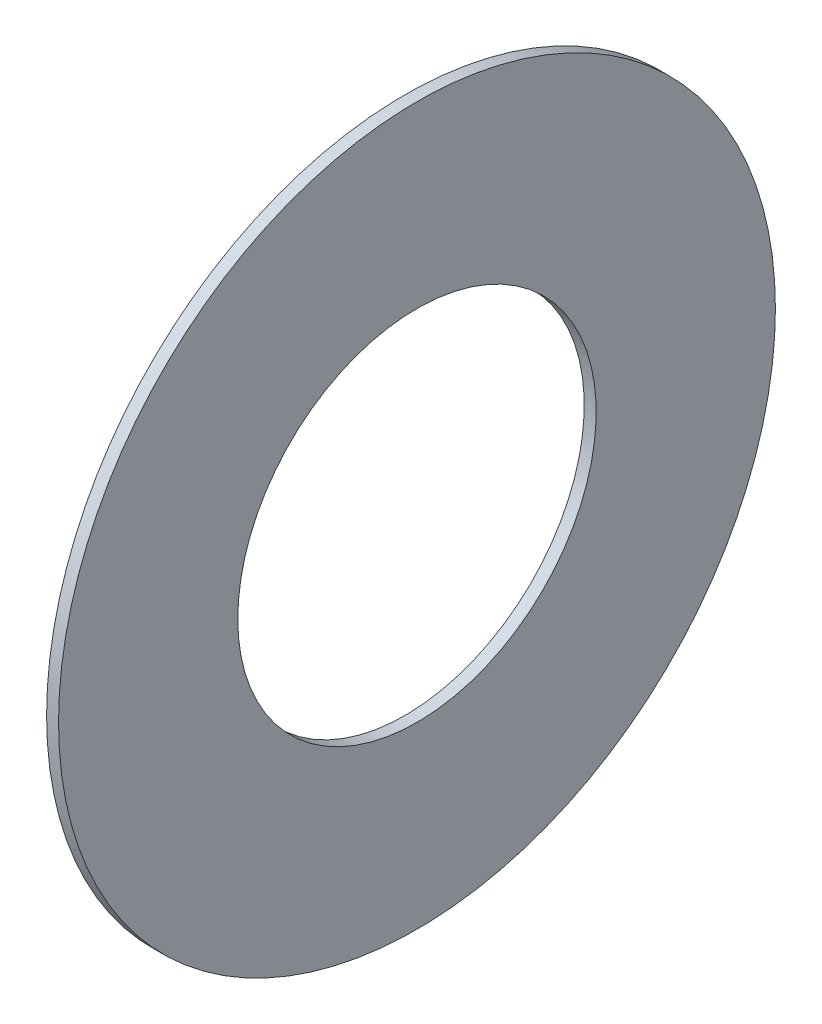
ISO-10303-21;
HEADER;
FILE_DESCRIPTION(('STEP AP214'),'2;1');
FILE_NAME('part.step','',(''),(''),'','','');
FILE_SCHEMA(('AUTOMOTIVE_DESIGN { 1 0 10303 214 1 1 1 1 }'));
ENDSEC;
DATA;
#1=APPLICATION_CONTEXT('core data for automotive mechanical design processes');
#2=APPLICATION_PROTOCOL_DEFINITION('international standard','automotive_design',2000,#1);
#3=PRODUCT_CONTEXT('',#1,'mechanical');
#4=PRODUCT('Part','Part','',(#3));
#5=PRODUCT_RELATED_PRODUCT_CATEGORY('part','',(#4));
#6=PRODUCT_DEFINITION_FORMATION('','',#4);
#7=PRODUCT_DEFINITION_CONTEXT('part definition',#1,'design');
#8=PRODUCT_DEFINITION('design','',#6,#7);
#9=PRODUCT_DEFINITION_SHAPE('','',#8);
#10=(LENGTH_UNIT() NAMED_UNIT(*) SI_UNIT(.MILLI.,.METRE.));
#11=(NAMED_UNIT(*) PLANE_ANGLE_UNIT() SI_UNIT($,.RADIAN.));
#12=(NAMED_UNIT(*) SI_UNIT($,.STERADIAN.) SOLID_ANGLE_UNIT());
#13=UNCERTAINTY_MEASURE_WITH_UNIT(LENGTH_MEASURE(1.E-05),#10,'distance_accuracy_value','');
#14=(GEOMETRIC_REPRESENTATION_CONTEXT(3) GLOBAL_UNCERTAINTY_ASSIGNED_CONTEXT((#13)) GLOBAL_UNIT_ASSIGNED_CONTEXT((#10,
#11,#12)) REPRESENTATION_CONTEXT('',''));
#15=CARTESIAN_POINT('',(0.,0.,0.));
#16=DIRECTION('',(0.,0.,1.));
#17=DIRECTION('',(1.,0.,0.));
#18=AXIS2_PLACEMENT_3D('',#15,#16,#17);
#19=CARTESIAN_POINT('',(1.,0.,0.));
#20=DIRECTION('',(-1.,0.,0.));
#21=DIRECTION('',(0.,0.,1.));
#22=AXIS2_PLACEMENT_3D('',#19,#20,#21);
#23=CYLINDRICAL_SURFACE('',#22,30.);
#24=CARTESIAN_POINT('',(1.,0.,0.));
#25=DIRECTION('',(1.,0.,0.));
#26=DIRECTION('',(0.,0.,-1.));
#27=AXIS2_PLACEMENT_3D('',#24,#25,#26);
#28=CIRCLE('',#27,30.);
#29=CARTESIAN_POINT('',(1.,0.,-30.));
#30=VERTEX_POINT('',#29);
#31=EDGE_CURVE('E10',#30,#30,#28,.T.);
#32=ORIENTED_EDGE('',*,*,#31,.F.);
#33=EDGE_LOOP('',(#32));
#34=FACE_BOUND('',#33,.T.);
#35=CARTESIAN_POINT('',(0.,0.,0.));
#36=DIRECTION('',(1.,0.,0.));
#37=DIRECTION('',(0.,0.,-1.));
#38=AXIS2_PLACEMENT_3D('',#35,#36,#37);
#39=CIRCLE('',#38,30.);
#40=CARTESIAN_POINT('',(0.,0.,-30.));
#41=VERTEX_POINT('',#40);
#42=EDGE_CURVE('E36',#41,#41,#39,.T.);
#43=ORIENTED_EDGE('',*,*,#42,.T.);
#44=EDGE_LOOP('',(#43));
#45=FACE_BOUND('',#44,.T.);
#46=ADVANCED_FACE('F33',(#34,#45),#23,.T.);
#47=CARTESIAN_POINT('',(1.,0.,0.));
#48=DIRECTION('',(1.,0.,0.));
#49=DIRECTION('',(0.,0.,-1.));
#50=AXIS2_PLACEMENT_3D('',#47,#48,#49);
#51=PLANE('',#50);
#52=CARTESIAN_POINT('',(1.,0.,0.));
#53=DIRECTION('',(-1.,0.,0.));
#54=DIRECTION('',(0.,0.,1.));
#55=AXIS2_PLACEMENT_3D('',#52,#53,#54);
#56=CIRCLE('',#55,15.);
#57=CARTESIAN_POINT('',(1.,0.,15.));
#58=VERTEX_POINT('',#57);
#59=EDGE_CURVE('E43',#58,#58,#56,.T.);
#60=ORIENTED_EDGE('',*,*,#59,.T.);
#61=EDGE_LOOP('',(#60));
#62=FACE_BOUND('',#61,.T.);
#63=ORIENTED_EDGE('',*,*,#31,.T.);
#64=EDGE_LOOP('',(#63));
#65=FACE_BOUND('',#64,.T.);
#66=ADVANCED_FACE('F51',(#62,#65),#51,.T.);
#67=CARTESIAN_POINT('',(0.,0.,0.));
#68=DIRECTION('',(1.,0.,0.));
#69=DIRECTION('',(0.,0.,-1.));
#70=AXIS2_PLACEMENT_3D('',#67,#68,#69);
#71=PLANE('',#70);
#72=CARTESIAN_POINT('',(0.,0.,0.));
#73=DIRECTION('',(-1.,0.,0.));
#74=DIRECTION('',(0.,0.,1.));
#75=AXIS2_PLACEMENT_3D('',#72,#73,#74);
#76=CIRCLE('',#75,15.);
#77=CARTESIAN_POINT('',(0.,0.,15.));
#78=VERTEX_POINT('',#77);
#79=EDGE_CURVE('E45',#78,#78,#76,.T.);
#80=ORIENTED_EDGE('',*,*,#79,.F.);
#81=EDGE_LOOP('',(#80));
#82=FACE_BOUND('',#81,.T.);
#83=ORIENTED_EDGE('',*,*,#42,.F.);
#84=EDGE_LOOP('',(#83));
#85=FACE_BOUND('',#84,.T.);
#86=ADVANCED_FACE('F56',(#82,#85),#71,.F.);
#87=CARTESIAN_POINT('',(1.,0.,0.));
#88=DIRECTION('',(-1.,0.,0.));
#89=DIRECTION('',(0.,0.,1.));
#90=AXIS2_PLACEMENT_3D('',#87,#88,#89);
#91=CYLINDRICAL_SURFACE('',#90,15.);
#92=ORIENTED_EDGE('',*,*,#59,.F.);
#93=EDGE_LOOP('',(#92));
#94=FACE_BOUND('',#93,.T.);
#95=ORIENTED_EDGE('',*,*,#79,.T.);
#96=EDGE_LOOP('',(#95));
#97=FACE_BOUND('',#96,.T.);
#98=ADVANCED_FACE('F53',(#94,#97),#91,.F.);
#99=CLOSED_SHELL('',(#46,#66,#86,#98));
#100=MANIFOLD_SOLID_BREP('B2',#99);
#101=ADVANCED_BREP_SHAPE_REPRESENTATION('',(#18,#100),#14);
#102=SHAPE_DEFINITION_REPRESENTATION(#9,#101);
ENDSEC;
END-ISO-10303-21;
